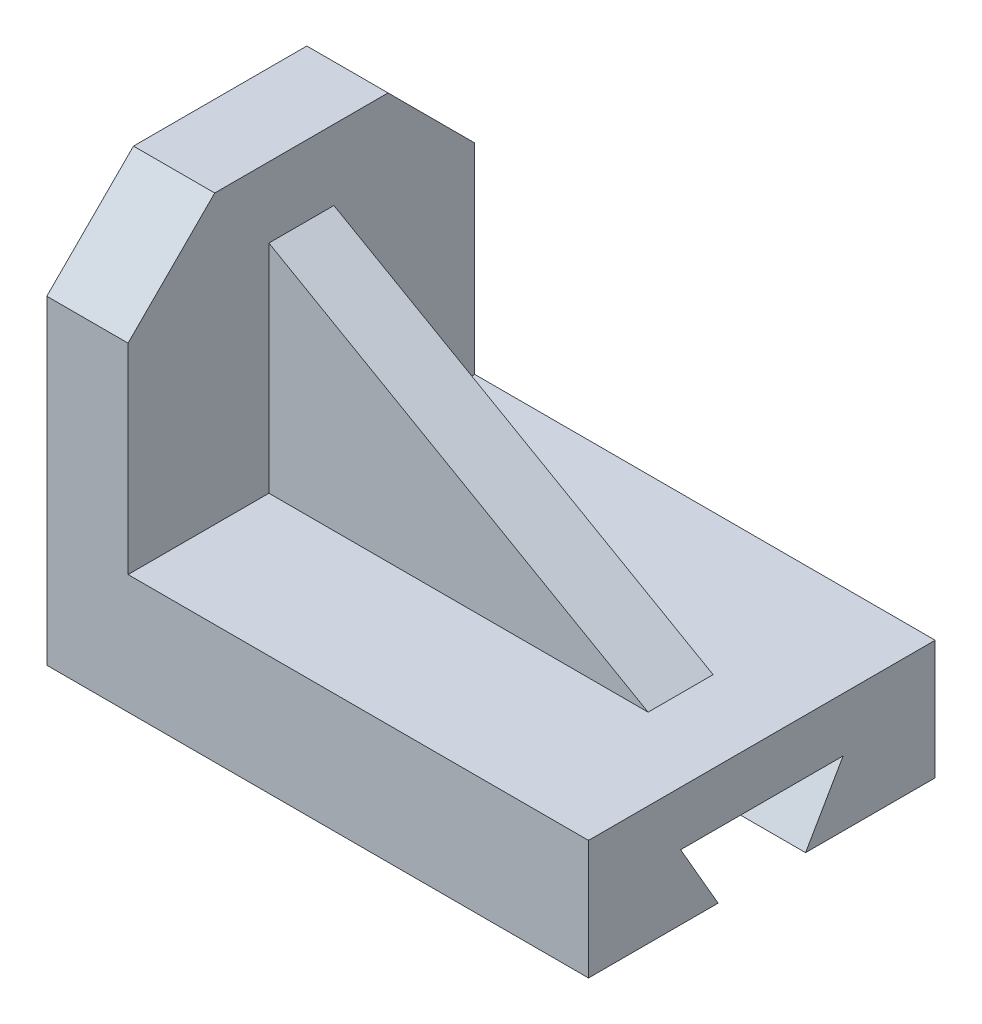
ISO-10303-21;
HEADER;
FILE_DESCRIPTION(('STEP AP214'),'2;1');
FILE_NAME('part.step','',(''),(''),'','','');
FILE_SCHEMA(('AUTOMOTIVE_DESIGN { 1 0 10303 214 1 1 1 1 }'));
ENDSEC;
DATA;
#1=APPLICATION_CONTEXT('core data for automotive mechanical design processes');
#2=APPLICATION_PROTOCOL_DEFINITION('international standard','automotive_design',2000,#1);
#3=PRODUCT_CONTEXT('',#1,'mechanical');
#4=PRODUCT('Part','Part','',(#3));
#5=PRODUCT_RELATED_PRODUCT_CATEGORY('part','',(#4));
#6=PRODUCT_DEFINITION_FORMATION('','',#4);
#7=PRODUCT_DEFINITION_CONTEXT('part definition',#1,'design');
#8=PRODUCT_DEFINITION('design','',#6,#7);
#9=PRODUCT_DEFINITION_SHAPE('','',#8);
#10=(LENGTH_UNIT() NAMED_UNIT(*) SI_UNIT(.MILLI.,.METRE.));
#11=(NAMED_UNIT(*) PLANE_ANGLE_UNIT() SI_UNIT($,.RADIAN.));
#12=(NAMED_UNIT(*) SI_UNIT($,.STERADIAN.) SOLID_ANGLE_UNIT());
#13=UNCERTAINTY_MEASURE_WITH_UNIT(LENGTH_MEASURE(1.E-05),#10,'distance_accuracy_value','');
#14=(GEOMETRIC_REPRESENTATION_CONTEXT(3) GLOBAL_UNCERTAINTY_ASSIGNED_CONTEXT((#13)) GLOBAL_UNIT_ASSIGNED_CONTEXT((#10,
#11,#12)) REPRESENTATION_CONTEXT('',''));
#15=CARTESIAN_POINT('',(0.,0.,0.));
#16=DIRECTION('',(0.,0.,1.));
#17=DIRECTION('',(1.,0.,0.));
#18=AXIS2_PLACEMENT_3D('',#15,#16,#17);
#19=CARTESIAN_POINT('',(0.,0.,64.));
#20=DIRECTION('',(0.,1.,0.));
#21=DIRECTION('',(0.,0.,1.));
#22=AXIS2_PLACEMENT_3D('',#19,#20,#21);
#23=PLANE('',#22);
#24=DIRECTION('',(0.,0.,-1.));
#25=VECTOR('',#24,1.);
#26=CARTESIAN_POINT('',(0.,0.,64.));
#27=LINE('',#26,#25);
#28=CARTESIAN_POINT('',(0.,0.,64.));
#29=VERTEX_POINT('',#28);
#30=CARTESIAN_POINT('',(0.,0.,40.0717967697244));
#31=VERTEX_POINT('',#30);
#32=EDGE_CURVE('E11',#29,#31,#27,.T.);
#33=ORIENTED_EDGE('',*,*,#32,.T.);
#34=DIRECTION('',(1.,0.,0.));
#35=VECTOR('',#34,1.);
#36=CARTESIAN_POINT('',(0.,0.,40.0717967697244));
#37=LINE('',#36,#35);
#38=CARTESIAN_POINT('',(100.,0.,40.0717967697244));
#39=VERTEX_POINT('',#38);
#40=EDGE_CURVE('E143',#31,#39,#37,.T.);
#41=ORIENTED_EDGE('',*,*,#40,.T.);
#42=DIRECTION('',(0.,0.,-1.));
#43=VECTOR('',#42,1.);
#44=CARTESIAN_POINT('',(100.,0.,64.));
#45=LINE('',#44,#43);
#46=CARTESIAN_POINT('',(100.,0.,64.));
#47=VERTEX_POINT('',#46);
#48=EDGE_CURVE('E164',#47,#39,#45,.T.);
#49=ORIENTED_EDGE('',*,*,#48,.F.);
#50=DIRECTION('',(1.,0.,0.));
#51=VECTOR('',#50,1.);
#52=CARTESIAN_POINT('',(0.,0.,64.));
#53=LINE('',#52,#51);
#54=EDGE_CURVE('E162',#29,#47,#53,.T.);
#55=ORIENTED_EDGE('',*,*,#54,.F.);
#56=EDGE_LOOP('',(#33,#41,#49,#55));
#57=FACE_BOUND('',#56,.T.);
#58=ADVANCED_FACE('F35',(#57),#23,.F.);
#59=CARTESIAN_POINT('',(0.,22.,64.));
#60=DIRECTION('',(0.,-1.,0.));
#61=DIRECTION('',(0.,0.,-1.));
#62=AXIS2_PLACEMENT_3D('',#59,#60,#61);
#63=PLANE('',#62);
#64=DIRECTION('',(-1.,0.,0.));
#65=VECTOR('',#64,1.);
#66=CARTESIAN_POINT('',(85.,22.,26.));
#67=LINE('',#66,#65);
#68=CARTESIAN_POINT('',(85.,22.,26.));
#69=VERTEX_POINT('',#68);
#70=CARTESIAN_POINT('',(15.,22.,26.));
#71=VERTEX_POINT('',#70);
#72=EDGE_CURVE('E253',#69,#71,#67,.T.);
#73=ORIENTED_EDGE('',*,*,#72,.F.);
#74=DIRECTION('',(0.,0.,-1.));
#75=VECTOR('',#74,1.);
#76=CARTESIAN_POINT('',(85.,22.,0.));
#77=LINE('',#76,#75);
#78=CARTESIAN_POINT('',(85.,22.,38.));
#79=VERTEX_POINT('',#78);
#80=EDGE_CURVE('E323',#79,#69,#77,.T.);
#81=ORIENTED_EDGE('',*,*,#80,.F.);
#82=DIRECTION('',(-1.,0.,0.));
#83=VECTOR('',#82,1.);
#84=CARTESIAN_POINT('',(85.,22.,38.));
#85=LINE('',#84,#83);
#86=CARTESIAN_POINT('',(15.,22.,38.));
#87=VERTEX_POINT('',#86);
#88=EDGE_CURVE('E325',#79,#87,#85,.T.);
#89=ORIENTED_EDGE('',*,*,#88,.T.);
#90=DIRECTION('',(0.,0.,1.));
#91=VECTOR('',#90,1.);
#92=CARTESIAN_POINT('',(15.,22.,64.));
#93=LINE('',#92,#91);
#94=CARTESIAN_POINT('',(15.,22.,64.));
#95=VERTEX_POINT('',#94);
#96=EDGE_CURVE('E229',#87,#95,#93,.T.);
#97=ORIENTED_EDGE('',*,*,#96,.T.);
#98=DIRECTION('',(-1.,0.,0.));
#99=VECTOR('',#98,1.);
#100=CARTESIAN_POINT('',(0.,22.,64.));
#101=LINE('',#100,#99);
#102=CARTESIAN_POINT('',(100.,22.,64.));
#103=VERTEX_POINT('',#102);
#104=EDGE_CURVE('E186',#103,#95,#101,.T.);
#105=ORIENTED_EDGE('',*,*,#104,.F.);
#106=DIRECTION('',(0.,0.,-1.));
#107=VECTOR('',#106,1.);
#108=CARTESIAN_POINT('',(100.,22.,64.));
#109=LINE('',#108,#107);
#110=CARTESIAN_POINT('',(100.,22.,0.));
#111=VERTEX_POINT('',#110);
#112=EDGE_CURVE('E188',#103,#111,#109,.T.);
#113=ORIENTED_EDGE('',*,*,#112,.T.);
#114=DIRECTION('',(-1.,0.,0.));
#115=VECTOR('',#114,1.);
#116=CARTESIAN_POINT('',(0.,22.,0.));
#117=LINE('',#116,#115);
#118=CARTESIAN_POINT('',(15.,22.,0.));
#119=VERTEX_POINT('',#118);
#120=EDGE_CURVE('E177',#111,#119,#117,.T.);
#121=ORIENTED_EDGE('',*,*,#120,.T.);
#122=EDGE_CURVE('E182',#119,#71,#93,.T.);
#123=ORIENTED_EDGE('',*,*,#122,.T.);
#124=EDGE_LOOP('',(#73,#81,#89,#97,#105,#113,#121,#123));
#125=FACE_BOUND('',#124,.T.);
#126=ADVANCED_FACE('F220',(#125),#63,.F.);
#127=CARTESIAN_POINT('',(15.,0.,0.));
#128=DIRECTION('',(1.,0.,0.));
#129=DIRECTION('',(0.,0.,-1.));
#130=AXIS2_PLACEMENT_3D('',#127,#128,#129);
#131=PLANE('',#130);
#132=DIRECTION('',(0.,-1.,0.));
#133=VECTOR('',#132,1.);
#134=CARTESIAN_POINT('',(15.,0.,0.));
#135=LINE('',#134,#133);
#136=CARTESIAN_POINT('',(15.,59.,0.));
#137=VERTEX_POINT('',#136);
#138=EDGE_CURVE('E215',#137,#119,#135,.T.);
#139=ORIENTED_EDGE('',*,*,#138,.F.);
#140=DIRECTION('',(0.,-0.707106781186548,-0.707106781186548));
#141=VECTOR('',#140,1.);
#142=CARTESIAN_POINT('',(15.,75.,16.));
#143=LINE('',#142,#141);
#144=CARTESIAN_POINT('',(15.,75.,16.));
#145=VERTEX_POINT('',#144);
#146=EDGE_CURVE('E245',#145,#137,#143,.T.);
#147=ORIENTED_EDGE('',*,*,#146,.F.);
#148=DIRECTION('',(0.,0.,-1.));
#149=VECTOR('',#148,1.);
#150=CARTESIAN_POINT('',(15.,75.,16.));
#151=LINE('',#150,#149);
#152=CARTESIAN_POINT('',(15.,75.,48.));
#153=VERTEX_POINT('',#152);
#154=EDGE_CURVE('E247',#153,#145,#151,.T.);
#155=ORIENTED_EDGE('',*,*,#154,.F.);
#156=DIRECTION('',(0.,0.707106781186548,-0.707106781186548));
#157=VECTOR('',#156,1.);
#158=CARTESIAN_POINT('',(15.,75.,48.));
#159=LINE('',#158,#157);
#160=CARTESIAN_POINT('',(15.,59.,64.));
#161=VERTEX_POINT('',#160);
#162=EDGE_CURVE('E257',#161,#153,#159,.T.);
#163=ORIENTED_EDGE('',*,*,#162,.F.);
#164=DIRECTION('',(0.,1.,0.));
#165=VECTOR('',#164,1.);
#166=CARTESIAN_POINT('',(15.,59.,64.));
#167=LINE('',#166,#165);
#168=EDGE_CURVE('E256',#95,#161,#167,.T.);
#169=ORIENTED_EDGE('',*,*,#168,.F.);
#170=ORIENTED_EDGE('',*,*,#96,.F.);
#171=DIRECTION('',(0.,1.,0.));
#172=VECTOR('',#171,1.);
#173=CARTESIAN_POINT('',(15.,0.,38.));
#174=LINE('',#173,#172);
#175=CARTESIAN_POINT('',(15.,62.,38.));
#176=VERTEX_POINT('',#175);
#177=EDGE_CURVE('E326',#87,#176,#174,.T.);
#178=ORIENTED_EDGE('',*,*,#177,.T.);
#179=DIRECTION('',(0.,0.,-1.));
#180=VECTOR('',#179,1.);
#181=CARTESIAN_POINT('',(15.,62.,0.));
#182=LINE('',#181,#180);
#183=CARTESIAN_POINT('',(15.,62.,26.));
#184=VERTEX_POINT('',#183);
#185=EDGE_CURVE('E328',#176,#184,#182,.T.);
#186=ORIENTED_EDGE('',*,*,#185,.T.);
#187=DIRECTION('',(0.,1.,0.));
#188=VECTOR('',#187,1.);
#189=CARTESIAN_POINT('',(15.,0.,26.));
#190=LINE('',#189,#188);
#191=EDGE_CURVE('E228',#71,#184,#190,.T.);
#192=ORIENTED_EDGE('',*,*,#191,.F.);
#193=ORIENTED_EDGE('',*,*,#122,.F.);
#194=EDGE_LOOP('',(#139,#147,#155,#163,#169,#170,#178,#186,#192,#193));
#195=FACE_BOUND('',#194,.T.);
#196=ADVANCED_FACE('F224',(#195),#131,.T.);
#197=CARTESIAN_POINT('',(0.,0.,64.));
#198=DIRECTION('',(1.,0.,0.));
#199=DIRECTION('',(0.,0.,-1.));
#200=AXIS2_PLACEMENT_3D('',#197,#198,#199);
#201=PLANE('',#200);
#202=DIRECTION('',(0.,0.,1.));
#203=VECTOR('',#202,1.);
#204=CARTESIAN_POINT('',(0.,12.,17.));
#205=LINE('',#204,#203);
#206=CARTESIAN_POINT('',(0.,12.,17.));
#207=VERTEX_POINT('',#206);
#208=CARTESIAN_POINT('',(0.,12.,47.));
#209=VERTEX_POINT('',#208);
#210=EDGE_CURVE('E153',#207,#209,#205,.T.);
#211=ORIENTED_EDGE('',*,*,#210,.T.);
#212=DIRECTION('',(0.,-0.866025403784436,-0.500000000000004));
#213=VECTOR('',#212,1.);
#214=CARTESIAN_POINT('',(0.,0.,40.0717967697244));
#215=LINE('',#214,#213);
#216=EDGE_CURVE('E146',#209,#31,#215,.T.);
#217=ORIENTED_EDGE('',*,*,#216,.T.);
#218=ORIENTED_EDGE('',*,*,#32,.F.);
#219=DIRECTION('',(0.,-1.,0.));
#220=VECTOR('',#219,1.);
#221=CARTESIAN_POINT('',(0.,0.,64.));
#222=LINE('',#221,#220);
#223=CARTESIAN_POINT('',(0.,59.,64.));
#224=VERTEX_POINT('',#223);
#225=EDGE_CURVE('E168',#224,#29,#222,.T.);
#226=ORIENTED_EDGE('',*,*,#225,.F.);
#227=DIRECTION('',(0.,0.707106781186548,-0.707106781186548));
#228=VECTOR('',#227,1.);
#229=CARTESIAN_POINT('',(0.,75.,48.));
#230=LINE('',#229,#228);
#231=CARTESIAN_POINT('',(0.,75.,48.));
#232=VERTEX_POINT('',#231);
#233=EDGE_CURVE('E251',#224,#232,#230,.T.);
#234=ORIENTED_EDGE('',*,*,#233,.T.);
#235=DIRECTION('',(0.,0.,-1.));
#236=VECTOR('',#235,1.);
#237=CARTESIAN_POINT('',(0.,75.,16.));
#238=LINE('',#237,#236);
#239=CARTESIAN_POINT('',(0.,75.,16.));
#240=VERTEX_POINT('',#239);
#241=EDGE_CURVE('E252',#232,#240,#238,.T.);
#242=ORIENTED_EDGE('',*,*,#241,.T.);
#243=DIRECTION('',(0.,-0.707106781186548,-0.707106781186548));
#244=VECTOR('',#243,1.);
#245=CARTESIAN_POINT('',(0.,75.,16.));
#246=LINE('',#245,#244);
#247=CARTESIAN_POINT('',(0.,59.,0.));
#248=VERTEX_POINT('',#247);
#249=EDGE_CURVE('E242',#240,#248,#246,.T.);
#250=ORIENTED_EDGE('',*,*,#249,.T.);
#251=DIRECTION('',(0.,-1.,0.));
#252=VECTOR('',#251,1.);
#253=CARTESIAN_POINT('',(0.,0.,0.));
#254=LINE('',#253,#252);
#255=CARTESIAN_POINT('',(0.,0.,0.));
#256=VERTEX_POINT('',#255);
#257=EDGE_CURVE('E189',#248,#256,#254,.T.);
#258=ORIENTED_EDGE('',*,*,#257,.T.);
#259=CARTESIAN_POINT('',(0.,0.,23.9282032302756));
#260=VERTEX_POINT('',#259);
#261=EDGE_CURVE('E43',#260,#256,#27,.T.);
#262=ORIENTED_EDGE('',*,*,#261,.F.);
#263=DIRECTION('',(0.,0.866025403784436,-0.500000000000004));
#264=VECTOR('',#263,1.);
#265=CARTESIAN_POINT('',(0.,0.,23.9282032302756));
#266=LINE('',#265,#264);
#267=EDGE_CURVE('E159',#260,#207,#266,.T.);
#268=ORIENTED_EDGE('',*,*,#267,.T.);
#269=EDGE_LOOP('',(#211,#217,#218,#226,#234,#242,#250,#258,#262,#268));
#270=FACE_BOUND('',#269,.T.);
#271=ADVANCED_FACE('F37',(#270),#201,.F.);
#272=CARTESIAN_POINT('',(100.,0.,23.9282032302756));
#273=VERTEX_POINT('',#272);
#274=CARTESIAN_POINT('',(100.,0.,0.));
#275=VERTEX_POINT('',#274);
#276=EDGE_CURVE('E197',#273,#275,#45,.T.);
#277=ORIENTED_EDGE('',*,*,#276,.F.);
#278=DIRECTION('',(1.,0.,0.));
#279=VECTOR('',#278,1.);
#280=CARTESIAN_POINT('',(0.,0.,23.9282032302756));
#281=LINE('',#280,#279);
#282=EDGE_CURVE('E50',#260,#273,#281,.T.);
#283=ORIENTED_EDGE('',*,*,#282,.F.);
#284=ORIENTED_EDGE('',*,*,#261,.T.);
#285=DIRECTION('',(1.,0.,0.));
#286=VECTOR('',#285,1.);
#287=CARTESIAN_POINT('',(0.,0.,0.));
#288=LINE('',#287,#286);
#289=EDGE_CURVE('E192',#256,#275,#288,.T.);
#290=ORIENTED_EDGE('',*,*,#289,.T.);
#291=EDGE_LOOP('',(#277,#283,#284,#290));
#292=FACE_BOUND('',#291,.T.);
#293=ADVANCED_FACE('F207',(#292),#23,.F.);
#294=CARTESIAN_POINT('',(100.,0.,64.));
#295=DIRECTION('',(-1.,0.,0.));
#296=DIRECTION('',(0.,0.,1.));
#297=AXIS2_PLACEMENT_3D('',#294,#295,#296);
#298=PLANE('',#297);
#299=ORIENTED_EDGE('',*,*,#48,.T.);
#300=DIRECTION('',(0.,-0.866025403784436,-0.500000000000004));
#301=VECTOR('',#300,1.);
#302=CARTESIAN_POINT('',(100.,0.,40.0717967697244));
#303=LINE('',#302,#301);
#304=CARTESIAN_POINT('',(100.,12.,47.));
#305=VERTEX_POINT('',#304);
#306=EDGE_CURVE('E149',#305,#39,#303,.T.);
#307=ORIENTED_EDGE('',*,*,#306,.F.);
#308=DIRECTION('',(0.,0.,1.));
#309=VECTOR('',#308,1.);
#310=CARTESIAN_POINT('',(100.,12.,17.));
#311=LINE('',#310,#309);
#312=CARTESIAN_POINT('',(100.,12.,17.));
#313=VERTEX_POINT('',#312);
#314=EDGE_CURVE('E160',#313,#305,#311,.T.);
#315=ORIENTED_EDGE('',*,*,#314,.F.);
#316=DIRECTION('',(0.,0.866025403784436,-0.500000000000004));
#317=VECTOR('',#316,1.);
#318=CARTESIAN_POINT('',(100.,0.,23.9282032302756));
#319=LINE('',#318,#317);
#320=EDGE_CURVE('E204',#273,#313,#319,.T.);
#321=ORIENTED_EDGE('',*,*,#320,.F.);
#322=ORIENTED_EDGE('',*,*,#276,.T.);
#323=DIRECTION('',(0.,1.,0.));
#324=VECTOR('',#323,1.);
#325=CARTESIAN_POINT('',(100.,0.,0.));
#326=LINE('',#325,#324);
#327=EDGE_CURVE('E179',#275,#111,#326,.T.);
#328=ORIENTED_EDGE('',*,*,#327,.T.);
#329=ORIENTED_EDGE('',*,*,#112,.F.);
#330=DIRECTION('',(0.,1.,0.));
#331=VECTOR('',#330,1.);
#332=CARTESIAN_POINT('',(100.,0.,64.));
#333=LINE('',#332,#331);
#334=EDGE_CURVE('E167',#47,#103,#333,.T.);
#335=ORIENTED_EDGE('',*,*,#334,.F.);
#336=EDGE_LOOP('',(#299,#307,#315,#321,#322,#328,#329,#335));
#337=FACE_BOUND('',#336,.T.);
#338=ADVANCED_FACE('F200',(#337),#298,.F.);
#339=CARTESIAN_POINT('',(0.,0.,64.));
#340=DIRECTION('',(0.,0.,-1.));
#341=DIRECTION('',(-1.,0.,0.));
#342=AXIS2_PLACEMENT_3D('',#339,#340,#341);
#343=PLANE('',#342);
#344=ORIENTED_EDGE('',*,*,#104,.T.);
#345=ORIENTED_EDGE('',*,*,#168,.T.);
#346=DIRECTION('',(-1.,0.,0.));
#347=VECTOR('',#346,1.);
#348=CARTESIAN_POINT('',(15.,59.,64.));
#349=LINE('',#348,#347);
#350=EDGE_CURVE('E174',#161,#224,#349,.T.);
#351=ORIENTED_EDGE('',*,*,#350,.T.);
#352=ORIENTED_EDGE('',*,*,#225,.T.);
#353=ORIENTED_EDGE('',*,*,#54,.T.);
#354=ORIENTED_EDGE('',*,*,#334,.T.);
#355=EDGE_LOOP('',(#344,#345,#351,#352,#353,#354));
#356=FACE_BOUND('',#355,.T.);
#357=ADVANCED_FACE('F172',(#356),#343,.F.);
#358=CARTESIAN_POINT('',(0.,0.,0.));
#359=DIRECTION('',(0.,0.,-1.));
#360=DIRECTION('',(-1.,0.,0.));
#361=AXIS2_PLACEMENT_3D('',#358,#359,#360);
#362=PLANE('',#361);
#363=ORIENTED_EDGE('',*,*,#327,.F.);
#364=ORIENTED_EDGE('',*,*,#289,.F.);
#365=ORIENTED_EDGE('',*,*,#257,.F.);
#366=DIRECTION('',(-1.,0.,0.));
#367=VECTOR('',#366,1.);
#368=CARTESIAN_POINT('',(15.,59.,0.));
#369=LINE('',#368,#367);
#370=EDGE_CURVE('E230',#137,#248,#369,.T.);
#371=ORIENTED_EDGE('',*,*,#370,.F.);
#372=ORIENTED_EDGE('',*,*,#138,.T.);
#373=ORIENTED_EDGE('',*,*,#120,.F.);
#374=EDGE_LOOP('',(#363,#364,#365,#371,#372,#373));
#375=FACE_BOUND('',#374,.T.);
#376=ADVANCED_FACE('F211',(#375),#362,.T.);
#377=CARTESIAN_POINT('',(15.,75.,16.));
#378=DIRECTION('',(0.,0.707106781186547,-0.707106781186547));
#379=DIRECTION('',(0.,0.707106781186548,0.707106781186548));
#380=AXIS2_PLACEMENT_3D('',#377,#378,#379);
#381=PLANE('',#380);
#382=ORIENTED_EDGE('',*,*,#249,.F.);
#383=DIRECTION('',(-1.,0.,0.));
#384=VECTOR('',#383,1.);
#385=CARTESIAN_POINT('',(15.,75.,16.));
#386=LINE('',#385,#384);
#387=EDGE_CURVE('E234',#145,#240,#386,.T.);
#388=ORIENTED_EDGE('',*,*,#387,.F.);
#389=ORIENTED_EDGE('',*,*,#146,.T.);
#390=ORIENTED_EDGE('',*,*,#370,.T.);
#391=EDGE_LOOP('',(#382,#388,#389,#390));
#392=FACE_BOUND('',#391,.T.);
#393=ADVANCED_FACE('F280',(#392),#381,.T.);
#394=CARTESIAN_POINT('',(15.,75.,16.));
#395=DIRECTION('',(0.,1.,0.));
#396=DIRECTION('',(0.,0.,1.));
#397=AXIS2_PLACEMENT_3D('',#394,#395,#396);
#398=PLANE('',#397);
#399=ORIENTED_EDGE('',*,*,#241,.F.);
#400=DIRECTION('',(-1.,0.,0.));
#401=VECTOR('',#400,1.);
#402=CARTESIAN_POINT('',(15.,75.,48.));
#403=LINE('',#402,#401);
#404=EDGE_CURVE('E239',#153,#232,#403,.T.);
#405=ORIENTED_EDGE('',*,*,#404,.F.);
#406=ORIENTED_EDGE('',*,*,#154,.T.);
#407=ORIENTED_EDGE('',*,*,#387,.T.);
#408=EDGE_LOOP('',(#399,#405,#406,#407));
#409=FACE_BOUND('',#408,.T.);
#410=ADVANCED_FACE('F266',(#409),#398,.T.);
#411=CARTESIAN_POINT('',(15.,75.,48.));
#412=DIRECTION('',(0.,0.707106781186547,0.707106781186547));
#413=DIRECTION('',(0.,-0.707106781186548,0.707106781186548));
#414=AXIS2_PLACEMENT_3D('',#411,#412,#413);
#415=PLANE('',#414);
#416=ORIENTED_EDGE('',*,*,#233,.F.);
#417=ORIENTED_EDGE('',*,*,#350,.F.);
#418=ORIENTED_EDGE('',*,*,#162,.T.);
#419=ORIENTED_EDGE('',*,*,#404,.T.);
#420=EDGE_LOOP('',(#416,#417,#418,#419));
#421=FACE_BOUND('',#420,.T.);
#422=ADVANCED_FACE('F269',(#421),#415,.T.);
#423=CARTESIAN_POINT('',(85.,0.,26.));
#424=DIRECTION('',(0.,0.,1.));
#425=DIRECTION('',(1.,0.,0.));
#426=AXIS2_PLACEMENT_3D('',#423,#424,#425);
#427=PLANE('',#426);
#428=ORIENTED_EDGE('',*,*,#191,.T.);
#429=DIRECTION('',(0.868243142124459,-0.496138938356834,0.));
#430=VECTOR('',#429,1.);
#431=CARTESIAN_POINT('',(94.4769230769231,16.5846153846154,26.));
#432=LINE('',#431,#430);
#433=EDGE_CURVE('E320',#184,#69,#432,.T.);
#434=ORIENTED_EDGE('',*,*,#433,.T.);
#435=ORIENTED_EDGE('',*,*,#72,.T.);
#436=EDGE_LOOP('',(#428,#434,#435));
#437=FACE_BOUND('',#436,.T.);
#438=ADVANCED_FACE('F271',(#437),#427,.F.);
#439=CARTESIAN_POINT('',(85.,0.,38.));
#440=DIRECTION('',(0.,0.,1.));
#441=DIRECTION('',(1.,0.,0.));
#442=AXIS2_PLACEMENT_3D('',#439,#440,#441);
#443=PLANE('',#442);
#444=DIRECTION('',(0.868243142124459,-0.496138938356834,0.));
#445=VECTOR('',#444,1.);
#446=CARTESIAN_POINT('',(15.,62.,38.));
#447=LINE('',#446,#445);
#448=EDGE_CURVE('E58',#176,#79,#447,.T.);
#449=ORIENTED_EDGE('',*,*,#448,.F.);
#450=ORIENTED_EDGE('',*,*,#177,.F.);
#451=ORIENTED_EDGE('',*,*,#88,.F.);
#452=EDGE_LOOP('',(#449,#450,#451));
#453=FACE_BOUND('',#452,.T.);
#454=ADVANCED_FACE('F277',(#453),#443,.T.);
#455=CARTESIAN_POINT('',(15.,62.,-32.));
#456=DIRECTION('',(-0.496138938356834,-0.868243142124459,0.));
#457=DIRECTION('',(0.868243142124459,-0.496138938356834,0.));
#458=AXIS2_PLACEMENT_3D('',#455,#456,#457);
#459=PLANE('',#458);
#460=ORIENTED_EDGE('',*,*,#185,.F.);
#461=ORIENTED_EDGE('',*,*,#448,.T.);
#462=ORIENTED_EDGE('',*,*,#80,.T.);
#463=ORIENTED_EDGE('',*,*,#433,.F.);
#464=EDGE_LOOP('',(#460,#461,#462,#463));
#465=FACE_BOUND('',#464,.T.);
#466=ADVANCED_FACE('F334',(#465),#459,.F.);
#467=CARTESIAN_POINT('',(0.,0.,40.0717967697244));
#468=DIRECTION('',(0.,-0.500000000000004,0.866025403784436));
#469=DIRECTION('',(0.,-0.866025403784436,-0.500000000000004));
#470=AXIS2_PLACEMENT_3D('',#467,#468,#469);
#471=PLANE('',#470);
#472=ORIENTED_EDGE('',*,*,#306,.T.);
#473=ORIENTED_EDGE('',*,*,#40,.F.);
#474=ORIENTED_EDGE('',*,*,#216,.F.);
#475=DIRECTION('',(1.,0.,0.));
#476=VECTOR('',#475,1.);
#477=CARTESIAN_POINT('',(0.,12.,47.));
#478=LINE('',#477,#476);
#479=EDGE_CURVE('E314',#209,#305,#478,.T.);
#480=ORIENTED_EDGE('',*,*,#479,.T.);
#481=EDGE_LOOP('',(#472,#473,#474,#480));
#482=FACE_BOUND('',#481,.T.);
#483=ADVANCED_FACE('F145',(#482),#471,.F.);
#484=CARTESIAN_POINT('',(0.,12.,17.));
#485=DIRECTION('',(0.,1.,0.));
#486=DIRECTION('',(0.,0.,1.));
#487=AXIS2_PLACEMENT_3D('',#484,#485,#486);
#488=PLANE('',#487);
#489=ORIENTED_EDGE('',*,*,#314,.T.);
#490=ORIENTED_EDGE('',*,*,#479,.F.);
#491=ORIENTED_EDGE('',*,*,#210,.F.);
#492=DIRECTION('',(1.,0.,0.));
#493=VECTOR('',#492,1.);
#494=CARTESIAN_POINT('',(0.,12.,17.));
#495=LINE('',#494,#493);
#496=EDGE_CURVE('E316',#207,#313,#495,.T.);
#497=ORIENTED_EDGE('',*,*,#496,.T.);
#498=EDGE_LOOP('',(#489,#490,#491,#497));
#499=FACE_BOUND('',#498,.T.);
#500=ADVANCED_FACE('F341',(#499),#488,.F.);
#501=CARTESIAN_POINT('',(0.,0.,23.9282032302756));
#502=DIRECTION('',(0.,-0.500000000000004,-0.866025403784436));
#503=DIRECTION('',(0.,0.866025403784436,-0.500000000000004));
#504=AXIS2_PLACEMENT_3D('',#501,#502,#503);
#505=PLANE('',#504);
#506=ORIENTED_EDGE('',*,*,#320,.T.);
#507=ORIENTED_EDGE('',*,*,#496,.F.);
#508=ORIENTED_EDGE('',*,*,#267,.F.);
#509=ORIENTED_EDGE('',*,*,#282,.T.);
#510=EDGE_LOOP('',(#506,#507,#508,#509));
#511=FACE_BOUND('',#510,.T.);
#512=ADVANCED_FACE('F344',(#511),#505,.F.);
#513=CLOSED_SHELL('',(#58,#126,#196,#271,#293,#338,#357,#376,#393,#410,#422,#438,#454,#466,#483,
#500,#512));
#514=MANIFOLD_SOLID_BREP('B2',#513);
#515=ADVANCED_BREP_SHAPE_REPRESENTATION('',(#18,#514),#14);
#516=SHAPE_DEFINITION_REPRESENTATION(#9,#515);
ENDSEC;
END-ISO-10303-21;
